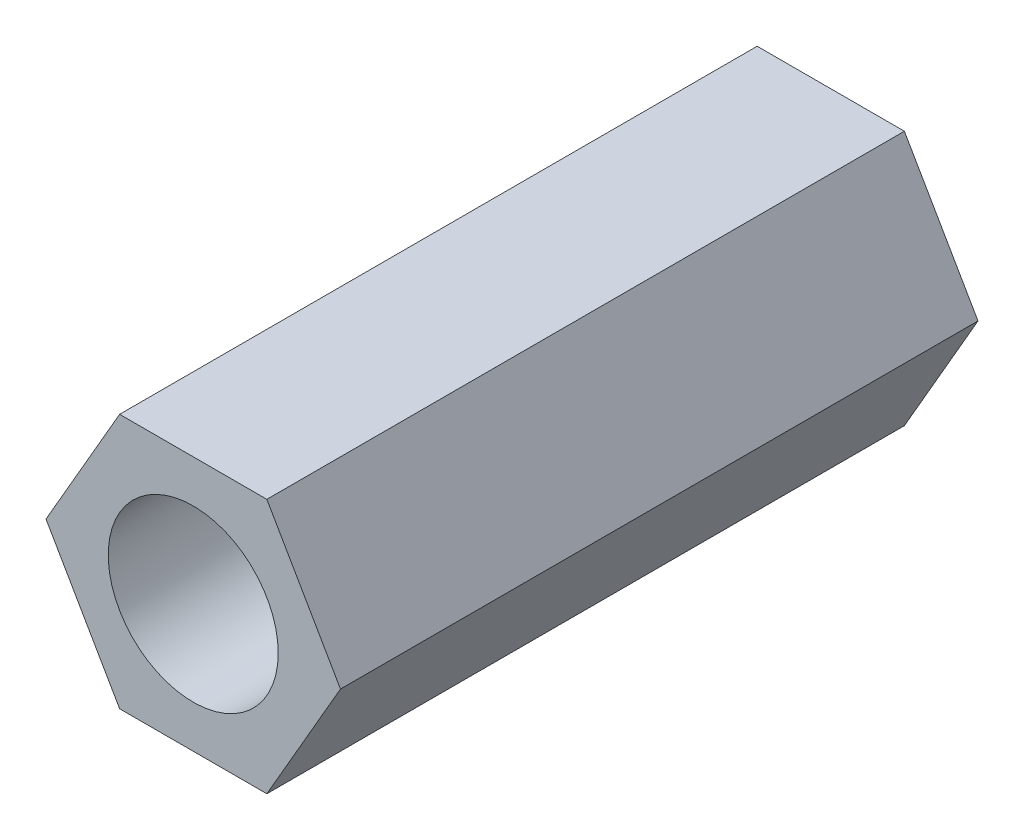
ISO-10303-21;
HEADER;
FILE_DESCRIPTION(('STEP AP214'),'2;1');
FILE_NAME('part.step','',(''),(''),'','','');
FILE_SCHEMA(('AUTOMOTIVE_DESIGN { 1 0 10303 214 1 1 1 1 }'));
ENDSEC;
DATA;
#1=APPLICATION_CONTEXT('core data for automotive mechanical design processes');
#2=APPLICATION_PROTOCOL_DEFINITION('international standard','automotive_design',2000,#1);
#3=PRODUCT_CONTEXT('',#1,'mechanical');
#4=PRODUCT('Part','Part','',(#3));
#5=PRODUCT_RELATED_PRODUCT_CATEGORY('part','',(#4));
#6=PRODUCT_DEFINITION_FORMATION('','',#4);
#7=PRODUCT_DEFINITION_CONTEXT('part definition',#1,'design');
#8=PRODUCT_DEFINITION('design','',#6,#7);
#9=PRODUCT_DEFINITION_SHAPE('','',#8);
#10=(LENGTH_UNIT() NAMED_UNIT(*) SI_UNIT(.MILLI.,.METRE.));
#11=(NAMED_UNIT(*) PLANE_ANGLE_UNIT() SI_UNIT($,.RADIAN.));
#12=(NAMED_UNIT(*) SI_UNIT($,.STERADIAN.) SOLID_ANGLE_UNIT());
#13=UNCERTAINTY_MEASURE_WITH_UNIT(LENGTH_MEASURE(1.E-05),#10,'distance_accuracy_value','');
#14=(GEOMETRIC_REPRESENTATION_CONTEXT(3) GLOBAL_UNCERTAINTY_ASSIGNED_CONTEXT((#13)) GLOBAL_UNIT_ASSIGNED_CONTEXT((#10,
#11,#12)) REPRESENTATION_CONTEXT('',''));
#15=CARTESIAN_POINT('',(0.,0.,0.));
#16=DIRECTION('',(0.,0.,1.));
#17=DIRECTION('',(1.,0.,0.));
#18=AXIS2_PLACEMENT_3D('',#15,#16,#17);
#19=CARTESIAN_POINT('',(0.,0.,15.));
#20=DIRECTION('',(0.,0.,1.));
#21=DIRECTION('',(1.,0.,0.));
#22=AXIS2_PLACEMENT_3D('',#19,#20,#21);
#23=PLANE('',#22);
#24=DIRECTION('',(-0.5,-0.866025403784439,0.));
#25=VECTOR('',#24,1.);
#26=CARTESIAN_POINT('',(-1.73205080756888,3.,15.));
#27=LINE('',#26,#25);
#28=CARTESIAN_POINT('',(-1.73205080756888,3.,15.));
#29=VERTEX_POINT('',#28);
#30=CARTESIAN_POINT('',(-3.46410161513775,0.,15.));
#31=VERTEX_POINT('',#30);
#32=EDGE_CURVE('E130',#29,#31,#27,.T.);
#33=ORIENTED_EDGE('',*,*,#32,.T.);
#34=DIRECTION('',(0.5,-0.866025403784439,0.));
#35=VECTOR('',#34,1.);
#36=CARTESIAN_POINT('',(-3.46410161513775,0.,15.));
#37=LINE('',#36,#35);
#38=CARTESIAN_POINT('',(-1.73205080756888,-3.,15.));
#39=VERTEX_POINT('',#38);
#40=EDGE_CURVE('E88',#31,#39,#37,.T.);
#41=ORIENTED_EDGE('',*,*,#40,.T.);
#42=DIRECTION('',(1.,0.,0.));
#43=VECTOR('',#42,1.);
#44=CARTESIAN_POINT('',(-1.73205080756888,-3.,15.));
#45=LINE('',#44,#43);
#46=CARTESIAN_POINT('',(1.73205080756888,-3.,15.));
#47=VERTEX_POINT('',#46);
#48=EDGE_CURVE('E101',#39,#47,#45,.T.);
#49=ORIENTED_EDGE('',*,*,#48,.T.);
#50=DIRECTION('',(0.5,0.866025403784439,0.));
#51=VECTOR('',#50,1.);
#52=CARTESIAN_POINT('',(1.73205080756888,-3.,15.));
#53=LINE('',#52,#51);
#54=CARTESIAN_POINT('',(3.46410161513775,0.,15.));
#55=VERTEX_POINT('',#54);
#56=EDGE_CURVE('E95',#47,#55,#53,.T.);
#57=ORIENTED_EDGE('',*,*,#56,.T.);
#58=DIRECTION('',(-0.5,0.866025403784439,0.));
#59=VECTOR('',#58,1.);
#60=CARTESIAN_POINT('',(3.46410161513775,0.,15.));
#61=LINE('',#60,#59);
#62=CARTESIAN_POINT('',(1.73205080756888,3.,15.));
#63=VERTEX_POINT('',#62);
#64=EDGE_CURVE('E99',#55,#63,#61,.T.);
#65=ORIENTED_EDGE('',*,*,#64,.T.);
#66=DIRECTION('',(-1.,0.,0.));
#67=VECTOR('',#66,1.);
#68=CARTESIAN_POINT('',(1.73205080756888,3.,15.));
#69=LINE('',#68,#67);
#70=EDGE_CURVE('E51',#63,#29,#69,.T.);
#71=ORIENTED_EDGE('',*,*,#70,.T.);
#72=EDGE_LOOP('',(#33,#41,#49,#57,#65,#71));
#73=FACE_BOUND('',#72,.T.);
#74=CARTESIAN_POINT('',(0.,0.,15.));
#75=DIRECTION('',(0.,0.,1.));
#76=DIRECTION('',(1.,0.,0.));
#77=AXIS2_PLACEMENT_3D('',#74,#75,#76);
#78=CIRCLE('',#77,2.);
#79=CARTESIAN_POINT('',(2.,0.,15.));
#80=VERTEX_POINT('',#79);
#81=EDGE_CURVE('E123',#80,#80,#78,.T.);
#82=ORIENTED_EDGE('',*,*,#81,.F.);
#83=EDGE_LOOP('',(#82));
#84=FACE_BOUND('',#83,.T.);
#85=ADVANCED_FACE('F34',(#73,#84),#23,.T.);
#86=CARTESIAN_POINT('',(0.,0.,0.));
#87=DIRECTION('',(0.,0.,1.));
#88=DIRECTION('',(1.,0.,0.));
#89=AXIS2_PLACEMENT_3D('',#86,#87,#88);
#90=PLANE('',#89);
#91=DIRECTION('',(-0.5,-0.866025403784439,0.));
#92=VECTOR('',#91,1.);
#93=CARTESIAN_POINT('',(-1.73205080756888,3.,0.));
#94=LINE('',#93,#92);
#95=CARTESIAN_POINT('',(-1.73205080756888,3.,0.));
#96=VERTEX_POINT('',#95);
#97=CARTESIAN_POINT('',(-3.46410161513775,0.,0.));
#98=VERTEX_POINT('',#97);
#99=EDGE_CURVE('E119',#96,#98,#94,.T.);
#100=ORIENTED_EDGE('',*,*,#99,.F.);
#101=DIRECTION('',(-1.,0.,0.));
#102=VECTOR('',#101,1.);
#103=CARTESIAN_POINT('',(1.73205080756888,3.,0.));
#104=LINE('',#103,#102);
#105=CARTESIAN_POINT('',(1.73205080756888,3.,0.));
#106=VERTEX_POINT('',#105);
#107=EDGE_CURVE('E80',#106,#96,#104,.T.);
#108=ORIENTED_EDGE('',*,*,#107,.F.);
#109=DIRECTION('',(-0.5,0.866025403784439,0.));
#110=VECTOR('',#109,1.);
#111=CARTESIAN_POINT('',(3.46410161513775,0.,0.));
#112=LINE('',#111,#110);
#113=CARTESIAN_POINT('',(3.46410161513775,0.,0.));
#114=VERTEX_POINT('',#113);
#115=EDGE_CURVE('E74',#114,#106,#112,.T.);
#116=ORIENTED_EDGE('',*,*,#115,.F.);
#117=DIRECTION('',(0.5,0.866025403784439,0.));
#118=VECTOR('',#117,1.);
#119=CARTESIAN_POINT('',(1.73205080756888,-3.,0.));
#120=LINE('',#119,#118);
#121=CARTESIAN_POINT('',(1.73205080756888,-3.,0.));
#122=VERTEX_POINT('',#121);
#123=EDGE_CURVE('E109',#122,#114,#120,.T.);
#124=ORIENTED_EDGE('',*,*,#123,.F.);
#125=DIRECTION('',(1.,0.,0.));
#126=VECTOR('',#125,1.);
#127=CARTESIAN_POINT('',(-1.73205080756888,-3.,0.));
#128=LINE('',#127,#126);
#129=CARTESIAN_POINT('',(-1.73205080756888,-3.,0.));
#130=VERTEX_POINT('',#129);
#131=EDGE_CURVE('E125',#130,#122,#128,.T.);
#132=ORIENTED_EDGE('',*,*,#131,.F.);
#133=DIRECTION('',(0.5,-0.866025403784439,0.));
#134=VECTOR('',#133,1.);
#135=CARTESIAN_POINT('',(-3.46410161513775,0.,0.));
#136=LINE('',#135,#134);
#137=EDGE_CURVE('E122',#98,#130,#136,.T.);
#138=ORIENTED_EDGE('',*,*,#137,.F.);
#139=EDGE_LOOP('',(#100,#108,#116,#124,#132,#138));
#140=FACE_BOUND('',#139,.T.);
#141=CARTESIAN_POINT('',(0.,0.,0.));
#142=DIRECTION('',(0.,0.,1.));
#143=DIRECTION('',(1.,0.,0.));
#144=AXIS2_PLACEMENT_3D('',#141,#142,#143);
#145=CIRCLE('',#144,2.);
#146=CARTESIAN_POINT('',(2.,0.,0.));
#147=VERTEX_POINT('',#146);
#148=EDGE_CURVE('E223',#147,#147,#145,.T.);
#149=ORIENTED_EDGE('',*,*,#148,.T.);
#150=EDGE_LOOP('',(#149));
#151=FACE_BOUND('',#150,.T.);
#152=ADVANCED_FACE('F139',(#140,#151),#90,.F.);
#153=CARTESIAN_POINT('',(-1.73205080756888,3.,15.));
#154=DIRECTION('',(0.866025403784439,-0.5,0.));
#155=DIRECTION('',(0.5,0.866025403784439,0.));
#156=AXIS2_PLACEMENT_3D('',#153,#154,#155);
#157=PLANE('',#156);
#158=ORIENTED_EDGE('',*,*,#99,.T.);
#159=DIRECTION('',(0.,0.,-1.));
#160=VECTOR('',#159,1.);
#161=CARTESIAN_POINT('',(-3.46410161513775,0.,15.));
#162=LINE('',#161,#160);
#163=EDGE_CURVE('E11',#31,#98,#162,.T.);
#164=ORIENTED_EDGE('',*,*,#163,.F.);
#165=ORIENTED_EDGE('',*,*,#32,.F.);
#166=DIRECTION('',(0.,0.,-1.));
#167=VECTOR('',#166,1.);
#168=CARTESIAN_POINT('',(-1.73205080756888,3.,15.));
#169=LINE('',#168,#167);
#170=EDGE_CURVE('E115',#29,#96,#169,.T.);
#171=ORIENTED_EDGE('',*,*,#170,.T.);
#172=EDGE_LOOP('',(#158,#164,#165,#171));
#173=FACE_BOUND('',#172,.T.);
#174=ADVANCED_FACE('F36',(#173),#157,.F.);
#175=CARTESIAN_POINT('',(-3.46410161513775,0.,15.));
#176=DIRECTION('',(0.866025403784439,0.5,0.));
#177=DIRECTION('',(-0.5,0.866025403784439,0.));
#178=AXIS2_PLACEMENT_3D('',#175,#176,#177);
#179=PLANE('',#178);
#180=ORIENTED_EDGE('',*,*,#137,.T.);
#181=DIRECTION('',(0.,0.,-1.));
#182=VECTOR('',#181,1.);
#183=CARTESIAN_POINT('',(-1.73205080756888,-3.,15.));
#184=LINE('',#183,#182);
#185=EDGE_CURVE('E43',#39,#130,#184,.T.);
#186=ORIENTED_EDGE('',*,*,#185,.F.);
#187=ORIENTED_EDGE('',*,*,#40,.F.);
#188=ORIENTED_EDGE('',*,*,#163,.T.);
#189=EDGE_LOOP('',(#180,#186,#187,#188));
#190=FACE_BOUND('',#189,.T.);
#191=ADVANCED_FACE('F164',(#190),#179,.F.);
#192=CARTESIAN_POINT('',(-1.73205080756888,-3.,15.));
#193=DIRECTION('',(0.,1.,0.));
#194=DIRECTION('',(0.,0.,1.));
#195=AXIS2_PLACEMENT_3D('',#192,#193,#194);
#196=PLANE('',#195);
#197=ORIENTED_EDGE('',*,*,#131,.T.);
#198=DIRECTION('',(0.,0.,-1.));
#199=VECTOR('',#198,1.);
#200=CARTESIAN_POINT('',(1.73205080756888,-3.,15.));
#201=LINE('',#200,#199);
#202=EDGE_CURVE('E110',#47,#122,#201,.T.);
#203=ORIENTED_EDGE('',*,*,#202,.F.);
#204=ORIENTED_EDGE('',*,*,#48,.F.);
#205=ORIENTED_EDGE('',*,*,#185,.T.);
#206=EDGE_LOOP('',(#197,#203,#204,#205));
#207=FACE_BOUND('',#206,.T.);
#208=ADVANCED_FACE('F136',(#207),#196,.F.);
#209=CARTESIAN_POINT('',(1.73205080756888,-3.,15.));
#210=DIRECTION('',(-0.866025403784438,0.5,0.));
#211=DIRECTION('',(-0.5,-0.866025403784439,0.));
#212=AXIS2_PLACEMENT_3D('',#209,#210,#211);
#213=PLANE('',#212);
#214=ORIENTED_EDGE('',*,*,#123,.T.);
#215=DIRECTION('',(0.,0.,-1.));
#216=VECTOR('',#215,1.);
#217=CARTESIAN_POINT('',(3.46410161513775,0.,15.));
#218=LINE('',#217,#216);
#219=EDGE_CURVE('E106',#55,#114,#218,.T.);
#220=ORIENTED_EDGE('',*,*,#219,.F.);
#221=ORIENTED_EDGE('',*,*,#56,.F.);
#222=ORIENTED_EDGE('',*,*,#202,.T.);
#223=EDGE_LOOP('',(#214,#220,#221,#222));
#224=FACE_BOUND('',#223,.T.);
#225=ADVANCED_FACE('F107',(#224),#213,.F.);
#226=CARTESIAN_POINT('',(3.46410161513775,0.,15.));
#227=DIRECTION('',(-0.866025403784439,-0.5,0.));
#228=DIRECTION('',(0.5,-0.866025403784439,0.));
#229=AXIS2_PLACEMENT_3D('',#226,#227,#228);
#230=PLANE('',#229);
#231=ORIENTED_EDGE('',*,*,#115,.T.);
#232=DIRECTION('',(0.,0.,-1.));
#233=VECTOR('',#232,1.);
#234=CARTESIAN_POINT('',(1.73205080756888,3.,15.));
#235=LINE('',#234,#233);
#236=EDGE_CURVE('E111',#63,#106,#235,.T.);
#237=ORIENTED_EDGE('',*,*,#236,.F.);
#238=ORIENTED_EDGE('',*,*,#64,.F.);
#239=ORIENTED_EDGE('',*,*,#219,.T.);
#240=EDGE_LOOP('',(#231,#237,#238,#239));
#241=FACE_BOUND('',#240,.T.);
#242=ADVANCED_FACE('F113',(#241),#230,.F.);
#243=CARTESIAN_POINT('',(1.73205080756888,3.,15.));
#244=DIRECTION('',(0.,-1.,0.));
#245=DIRECTION('',(1.,0.,0.));
#246=AXIS2_PLACEMENT_3D('',#243,#244,#245);
#247=PLANE('',#246);
#248=ORIENTED_EDGE('',*,*,#107,.T.);
#249=ORIENTED_EDGE('',*,*,#170,.F.);
#250=ORIENTED_EDGE('',*,*,#70,.F.);
#251=ORIENTED_EDGE('',*,*,#236,.T.);
#252=EDGE_LOOP('',(#248,#249,#250,#251));
#253=FACE_BOUND('',#252,.T.);
#254=ADVANCED_FACE('F144',(#253),#247,.F.);
#255=CARTESIAN_POINT('',(0.,0.,15.));
#256=DIRECTION('',(0.,0.,-1.));
#257=DIRECTION('',(-1.,0.,0.));
#258=AXIS2_PLACEMENT_3D('',#255,#256,#257);
#259=CYLINDRICAL_SURFACE('',#258,2.);
#260=ORIENTED_EDGE('',*,*,#81,.T.);
#261=EDGE_LOOP('',(#260));
#262=FACE_BOUND('',#261,.T.);
#263=ORIENTED_EDGE('',*,*,#148,.F.);
#264=EDGE_LOOP('',(#263));
#265=FACE_BOUND('',#264,.T.);
#266=ADVANCED_FACE('F146',(#262,#265),#259,.F.);
#267=CLOSED_SHELL('',(#85,#152,#174,#191,#208,#225,#242,#254,#266));
#268=MANIFOLD_SOLID_BREP('B2',#267);
#269=ADVANCED_BREP_SHAPE_REPRESENTATION('',(#18,#268),#14);
#270=SHAPE_DEFINITION_REPRESENTATION(#9,#269);
ENDSEC;
END-ISO-10303-21;
